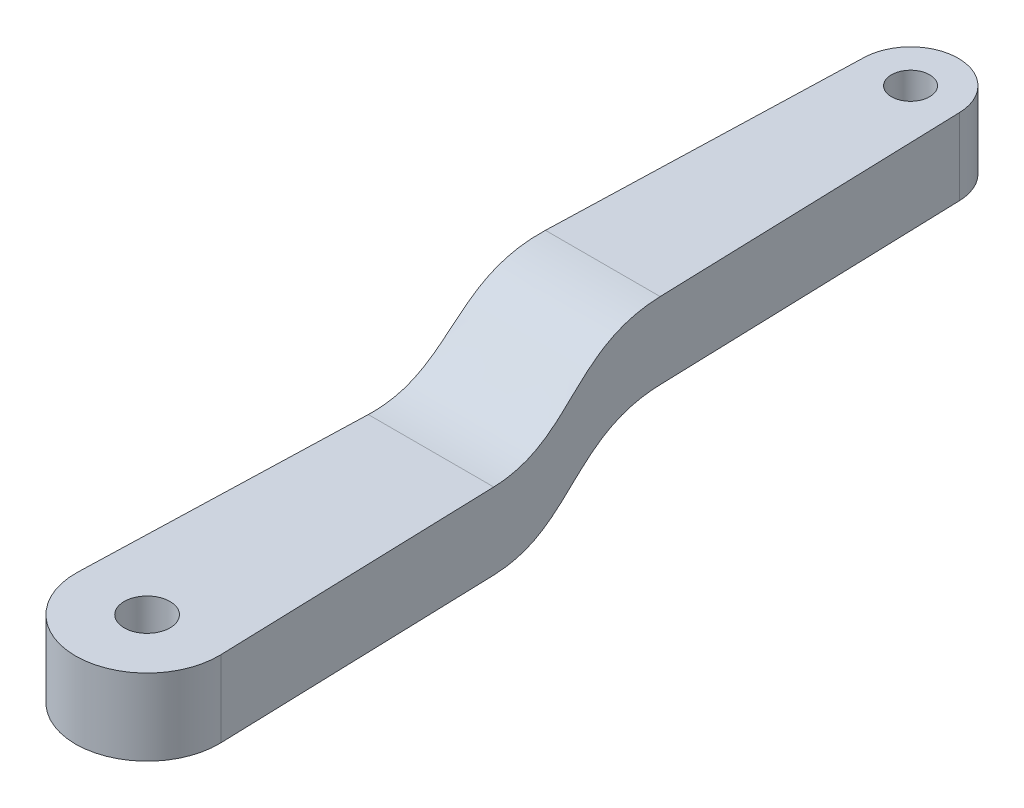
ISO-10303-21;
HEADER;
FILE_DESCRIPTION(('STEP AP214'),'2;1');
FILE_NAME('part.step','',(''),(''),'','','');
FILE_SCHEMA(('AUTOMOTIVE_DESIGN { 1 0 10303 214 1 1 1 1 }'));
ENDSEC;
DATA;
#1=APPLICATION_CONTEXT('core data for automotive mechanical design processes');
#2=APPLICATION_PROTOCOL_DEFINITION('international standard','automotive_design',2000,#1);
#3=PRODUCT_CONTEXT('',#1,'mechanical');
#4=PRODUCT('Part','Part','',(#3));
#5=PRODUCT_RELATED_PRODUCT_CATEGORY('part','',(#4));
#6=PRODUCT_DEFINITION_FORMATION('','',#4);
#7=PRODUCT_DEFINITION_CONTEXT('part definition',#1,'design');
#8=PRODUCT_DEFINITION('design','',#6,#7);
#9=PRODUCT_DEFINITION_SHAPE('','',#8);
#10=(LENGTH_UNIT() NAMED_UNIT(*) SI_UNIT(.MILLI.,.METRE.));
#11=(NAMED_UNIT(*) PLANE_ANGLE_UNIT() SI_UNIT($,.RADIAN.));
#12=(NAMED_UNIT(*) SI_UNIT($,.STERADIAN.) SOLID_ANGLE_UNIT());
#13=UNCERTAINTY_MEASURE_WITH_UNIT(LENGTH_MEASURE(1.E-05),#10,'distance_accuracy_value','');
#14=(GEOMETRIC_REPRESENTATION_CONTEXT(3) GLOBAL_UNCERTAINTY_ASSIGNED_CONTEXT((#13)) GLOBAL_UNIT_ASSIGNED_CONTEXT((#10,
#11,#12)) REPRESENTATION_CONTEXT('',''));
#15=CARTESIAN_POINT('',(0.,0.,0.));
#16=DIRECTION('',(0.,0.,1.));
#17=DIRECTION('',(1.,0.,0.));
#18=AXIS2_PLACEMENT_3D('',#15,#16,#17);
#19=CARTESIAN_POINT('',(-3.74816849805925,8.,-0.1171875));
#20=DIRECTION('',(-0.999511599482467,0.,-0.03125));
#21=DIRECTION('',(-0.03125,0.,0.999511599482467));
#22=AXIS2_PLACEMENT_3D('',#19,#20,#21);
#23=PLANE('',#22);
#24=CARTESIAN_POINT('',(-3.00537407625422,8.,-23.875));
#25=CARTESIAN_POINT('',(-3.00899626856634,7.99999811447068,-23.7591464565915));
#26=CARTESIAN_POINT('',(-3.01261921682236,7.99762205224938,-23.6432687347923));
#27=CARTESIAN_POINT('',(-3.01986588461488,7.98762582819716,-23.4114886222733));
#28=CARTESIAN_POINT('',(-3.02348958842345,7.97999417897568,-23.2955867346013));
#29=CARTESIAN_POINT('',(-3.03072334807188,7.95898012807748,-23.0642194809542));
#30=CARTESIAN_POINT('',(-3.03433339385222,7.94559409919129,-22.9487544367264));
#31=CARTESIAN_POINT('',(-3.04149604222825,7.91273441010356,-22.7196616324111));
#32=CARTESIAN_POINT('',(-3.04504887293707,7.89331211981688,-22.6060265762684));
#33=CARTESIAN_POINT('',(-3.05211162574662,7.84795765008467,-22.3801288688307));
#34=CARTESIAN_POINT('',(-3.05562157399063,7.82202966826932,-22.2678653813596));
#35=CARTESIAN_POINT('',(-3.06258461104756,7.76337242746774,-22.0451570195667));
#36=CARTESIAN_POINT('',(-3.06603771670245,7.7306452236531,-21.9347116065653));
#37=CARTESIAN_POINT('',(-3.07291092354682,7.65784401594248,-21.7148764076344));
#38=CARTESIAN_POINT('',(-3.07633021129159,7.6176911978973,-21.6055126392227));
#39=CARTESIAN_POINT('',(-3.08308128289557,7.53035833438566,-21.3895838591549));
#40=CARTESIAN_POINT('',(-3.08641303761071,7.48317598246282,-21.2830197796536));
#41=CARTESIAN_POINT('',(-3.09297523558486,7.38213161146654,-21.0731320038694));
#42=CARTESIAN_POINT('',(-3.09620569551587,7.32827069891802,-20.9698077743426));
#43=CARTESIAN_POINT('',(-3.10255697599939,7.21447136156176,-20.7666660618676));
#44=CARTESIAN_POINT('',(-3.10567787141685,7.15453719986446,-20.6668461844109));
#45=CARTESIAN_POINT('',(-3.11181289404608,7.02931859653401,-20.4706213434187));
#46=CARTESIAN_POINT('',(-3.11482701142475,6.96403366397703,-20.3742166943891));
#47=CARTESIAN_POINT('',(-3.12075588242364,6.82902127836733,-20.1845854836616));
#48=CARTESIAN_POINT('',(-3.12367063528852,6.75929379155421,-20.0913589461235));
#49=CARTESIAN_POINT('',(-3.1307123920809,6.58409364820335,-19.8661327830925));
#50=CARTESIAN_POINT('',(-3.13479241107756,6.47669878602012,-19.7356359410677));
#51=CARTESIAN_POINT('',(-3.14283976761855,6.25765857049981,-19.4782463024154));
#52=CARTESIAN_POINT('',(-3.1468070645867,6.14601171960363,-19.3513548035909));
#53=CARTESIAN_POINT('',(-3.15472022147431,5.92133612519889,-19.0982574564649));
#54=CARTESIAN_POINT('',(-3.15866600460157,5.80830465688984,-18.9720540643132));
#55=CARTESIAN_POINT('',(-3.166616737175,5.58433355528527,-18.7177548825045));
#56=CARTESIAN_POINT('',(-3.17062168915927,5.47339401219281,-18.5896590116673));
#57=CARTESIAN_POINT('',(-3.17746137297173,5.29192512122272,-18.3708960258325));
#58=CARTESIAN_POINT('',(-3.18025701645692,5.21990066362941,-18.2814791269057));
#59=CARTESIAN_POINT('',(-3.18593704499896,5.07951910489883,-18.0998069856846));
#60=CARTESIAN_POINT('',(-3.18882142131982,5.01116164454244,-18.0075520228054));
#61=CARTESIAN_POINT('',(-3.19469631094334,4.8792458364324,-17.819647372425));
#62=CARTESIAN_POINT('',(-3.19768682736743,4.81568762999029,-17.7239975850868));
#63=CARTESIAN_POINT('',(-3.20376665918675,4.69479797224297,-17.5295379874449));
#64=CARTESIAN_POINT('',(-3.20685535373065,4.63743474417882,-17.4307480346805));
#65=CARTESIAN_POINT('',(-3.21314705154159,4.52948419680022,-17.2295120365213));
#66=CARTESIAN_POINT('',(-3.2163500620259,4.47889730626798,-17.1270657602866));
#67=CARTESIAN_POINT('',(-3.22285965374168,4.38523774027144,-16.9188605625967));
#68=CARTESIAN_POINT('',(-3.22616617115923,4.34216053852604,-16.813103682189));
#69=CARTESIAN_POINT('',(-3.23252783162669,4.26785551141483,-16.6096299724548));
#70=CARTESIAN_POINT('',(-3.23557433808391,4.23586812949275,-16.5121893791145));
#71=CARTESIAN_POINT('',(-3.2417269258232,4.17827945117677,-16.3154027291224));
#72=CARTESIAN_POINT('',(-3.24483302921588,4.15268057627399,-16.2160559652766));
#73=CARTESIAN_POINT('',(-3.25109105069711,4.10773049962799,-16.0158970833471));
#74=CARTESIAN_POINT('',(-3.25424299850553,4.08838355846379,-15.9150840146919));
#75=CARTESIAN_POINT('',(-3.26064609014878,4.0553106814114,-15.7102851548525));
#76=CARTESIAN_POINT('',(-3.26389789614713,4.04171687806328,-15.6062781847847));
#77=CARTESIAN_POINT('',(-3.27041789545357,4.02036104210541,-15.3977401068517));
#78=CARTESIAN_POINT('',(-3.27368607846221,4.01259571814255,-15.2932093284079));
#79=CARTESIAN_POINT('',(-3.28022363463297,4.0024198611043,-15.0841097052098));
#80=CARTESIAN_POINT('',(-3.28349299001051,3.99999780980068,-14.979541429284));
#81=CARTESIAN_POINT('',(-3.28676150602055,3.99999999999999,-14.875));
#82=B_SPLINE_CURVE_WITH_KNOTS('',3,(#24,#25,#26,#27,#28,#29,#30,#31,#32,#33,#34,#35,#36,#37,#38,
#39,#40,#41,#42,#43,#44,#45,#46,#47,#48,#49,#50,#51,#52,#53,#54,#55,#56,#57,#58,#59,#60,#61,#62,
#63,#64,#65,#66,#67,#68,#69,#70,#71,#72,#73,#74,#75,#76,#77,#78,#79,#80,#81),.UNSPECIFIED.,.F.,
.F.,(4,2,2,2,2,2,2,2,2,2,2,2,2,2,2,2,2,2,2,2,2,2,2,2,2,2,2,2,4),(0.,0.347742323620094,
0.696247146968814,1.04497196933054,1.39080677439318,1.7364190096799,2.08192692983732,
2.43133774271035,2.78086345408208,3.13033133212243,3.4795555788932,3.82881190231912,
4.17807088017356,4.68505406893024,5.19221750017961,5.70062915463697,6.2090626817198,
6.55354643904929,6.89799638888688,7.24245647692373,7.58505612991816,7.92767745115358,
8.27009154638711,8.57768016079997,8.88538518671488,9.19329946793341,9.50794533828519,
9.82241339357373,10.1362029005321),.UNSPECIFIED.);
#83=CARTESIAN_POINT('',(-3.00537407625422,8.,-23.875));
#84=VERTEX_POINT('',#83);
#85=CARTESIAN_POINT('',(-3.28676150602055,3.99999999999999,-14.875));
#86=VERTEX_POINT('',#85);
#87=EDGE_CURVE('E170',#84,#86,#82,.T.);
#88=ORIENTED_EDGE('',*,*,#87,.F.);
#89=DIRECTION('',(0.03125,0.,-0.999511599482467));
#90=VECTOR('',#89,1.);
#91=CARTESIAN_POINT('',(-3.74816849805925,8.,-0.1171875));
#92=LINE('',#91,#90);
#93=CARTESIAN_POINT('',(-2.49877899870617,8.,-40.078125));
#94=VERTEX_POINT('',#93);
#95=EDGE_CURVE('E152',#84,#94,#92,.T.);
#96=ORIENTED_EDGE('',*,*,#95,.T.);
#97=DIRECTION('',(0.,-1.,0.));
#98=VECTOR('',#97,1.);
#99=CARTESIAN_POINT('',(-2.49877899870617,8.,-40.078125));
#100=LINE('',#99,#98);
#101=CARTESIAN_POINT('',(-2.49877899870617,3.99999999999997,-40.078125));
#102=VERTEX_POINT('',#101);
#103=EDGE_CURVE('E153',#94,#102,#100,.T.);
#104=ORIENTED_EDGE('',*,*,#103,.T.);
#105=DIRECTION('',(0.03125,0.,-0.999511599482467));
#106=VECTOR('',#105,1.);
#107=CARTESIAN_POINT('',(-3.74816849805925,3.99999999999956,-0.117187500000041));
#108=LINE('',#107,#106);
#109=CARTESIAN_POINT('',(-3.00537407625422,3.99999999999981,-23.8750000000001));
#110=VERTEX_POINT('',#109);
#111=EDGE_CURVE('E125',#110,#102,#108,.T.);
#112=ORIENTED_EDGE('',*,*,#111,.F.);
#113=CARTESIAN_POINT('',(-3.28676150602055,-2.05564731903252E-13,-14.875));
#114=CARTESIAN_POINT('',(-3.28426184922358,-3.10916420886166E-07,-14.9549499508253));
#115=CARTESIAN_POINT('',(-3.28176190787284,0.00141544638103309,-15.0349090029242));
#116=CARTESIAN_POINT('',(-3.27676038883779,0.00729896382046686,-15.1948794442223));
#117=CARTESIAN_POINT('',(-3.27425881850231,0.0117730439407663,-15.2748905983737));
#118=CARTESIAN_POINT('',(-3.26926097800554,0.0240007171491219,-15.4347433839381));
#119=CARTESIAN_POINT('',(-3.26676471521751,0.0317574478542365,-15.514584779522));
#120=CARTESIAN_POINT('',(-3.26178459192593,0.0507565413293511,-15.673870891419));
#121=CARTESIAN_POINT('',(-3.25930073390822,0.0619995763303122,-15.7533155282243));
#122=CARTESIAN_POINT('',(-3.25444100020128,0.0876796895535889,-15.9087510549601));
#123=CARTESIAN_POINT('',(-3.25206445786074,0.101987119071783,-15.9847632673129));
#124=CARTESIAN_POINT('',(-3.24733606996942,0.134126576001462,-16.135997780728));
#125=CARTESIAN_POINT('',(-3.24498421142991,0.151956640598806,-16.2112204972268));
#126=CARTESIAN_POINT('',(-3.24031121316153,0.191219283005152,-16.3606834083823));
#127=CARTESIAN_POINT('',(-3.23799005884654,0.212650078736213,-16.4349240695674));
#128=CARTESIAN_POINT('',(-3.23338416691736,0.259137001430183,-16.5822406266603));
#129=CARTESIAN_POINT('',(-3.23109942034004,0.284192220305363,-16.6553168092483));
#130=CARTESIAN_POINT('',(-3.22577842179646,0.347302288819191,-16.8255056017323));
#131=CARTESIAN_POINT('',(-3.22275918608796,0.38683687880492,-16.9220739573247));
#132=CARTESIAN_POINT('',(-3.21680709705607,0.472176722469682,-17.1124477822383));
#133=CARTESIAN_POINT('',(-3.21387428638797,0.517985011583562,-17.2062518872573));
#134=CARTESIAN_POINT('',(-3.20810325912489,0.615330808164649,-17.3908345653491));
#135=CARTESIAN_POINT('',(-3.20526504809516,0.666868651927938,-17.481612960421));
#136=CARTESIAN_POINT('',(-3.19822654991688,0.803236577579346,-17.7067348987291));
#137=CARTESIAN_POINT('',(-3.19408922337614,0.891394315511503,-17.8390646865152));
#138=CARTESIAN_POINT('',(-3.18601155289183,1.07654177664094,-18.097423897583));
#139=CARTESIAN_POINT('',(-3.18207134381031,1.1735374218522,-18.2234490073866));
#140=CARTESIAN_POINT('',(-3.17621693313786,1.32475052371355,-18.4106986513944));
#141=CARTESIAN_POINT('',(-3.1742485165408,1.37685496303989,-18.4736572184787));
#142=CARTESIAN_POINT('',(-3.17034199672757,1.48217537305044,-18.5986047982205));
#143=CARTESIAN_POINT('',(-3.16840388394272,1.53539097995111,-18.6605941169265));
#144=CARTESIAN_POINT('',(-3.16261947566933,1.69615843268284,-18.8456047782189));
#145=CARTESIAN_POINT('',(-3.15880353931474,1.80481955323385,-18.9676551029965));
#146=CARTESIAN_POINT('',(-3.15116859644418,2.02225977532091,-19.2118539497329));
#147=CARTESIAN_POINT('',(-3.14734959048039,2.13103889034325,-19.3340024540307));
#148=CARTESIAN_POINT('',(-3.1396264500734,2.34598325012027,-19.5810222435095));
#149=CARTESIAN_POINT('',(-3.13572216813251,2.45214315552807,-19.7058982463118));
#150=CARTESIAN_POINT('',(-3.12787115795367,2.65612700833793,-19.9570078700369));
#151=CARTESIAN_POINT('',(-3.12392815029102,2.75409566924486,-20.083122490698));
#152=CARTESIAN_POINT('',(-3.11586089673133,2.94206054796984,-20.3411485229823));
#153=CARTESIAN_POINT('',(-3.11173671976061,3.03205975915146,-20.47305773004));
#154=CARTESIAN_POINT('',(-3.10329564595472,3.20157133937444,-20.7430401678342));
#155=CARTESIAN_POINT('',(-3.09897925160187,3.28110912323676,-20.8810973269901));
#156=CARTESIAN_POINT('',(-3.09015795900712,3.42799293409708,-21.1632408236582));
#157=CARTESIAN_POINT('',(-3.08565346079606,3.4953633584271,-21.3073143664358));
#158=CARTESIAN_POINT('',(-3.07820015519447,3.59421720643877,-21.5457036593407));
#159=CARTESIAN_POINT('',(-3.0753022251385,3.62967772596589,-21.6383921299146));
#160=CARTESIAN_POINT('',(-3.06944654032857,3.6954937975381,-21.8256825264084));
#161=CARTESIAN_POINT('',(-3.06648872301669,3.72584366625831,-21.9202864532044));
#162=CARTESIAN_POINT('',(-3.06052292503167,3.78145688479419,-22.1110987503628));
#163=CARTESIAN_POINT('',(-3.05751488668034,3.80671387782111,-22.2073089655257));
#164=CARTESIAN_POINT('',(-3.05145891959695,3.85226330923503,-22.4010052645954));
#165=CARTESIAN_POINT('',(-3.04841095005528,3.87255016992129,-22.498492653772));
#166=CARTESIAN_POINT('',(-3.04204733008362,3.90974765535889,-22.7020290370159));
#167=CARTESIAN_POINT('',(-3.03872945870321,3.92626793277889,-22.8081490667859));
#168=CARTESIAN_POINT('',(-3.03207455611201,3.95407837207277,-23.0210019414525));
#169=CARTESIAN_POINT('',(-3.0287375371523,3.96537156689351,-23.127734394506));
#170=CARTESIAN_POINT('',(-3.02205835771419,3.98310079227812,-23.3413637488555));
#171=CARTESIAN_POINT('',(-3.01871622348338,3.98954715617945,-23.4482598106384));
#172=CARTESIAN_POINT('',(-3.01204055508105,3.99798662050492,-23.6617768667163));
#173=CARTESIAN_POINT('',(-3.00870704438009,3.99999845369575,-23.7683971103197));
#174=CARTESIAN_POINT('',(-3.00537407625422,3.99999999999981,-23.875));
#175=B_SPLINE_CURVE_WITH_KNOTS('',3,(#113,#114,#115,#116,#117,#118,#119,#120,#121,#122,#123,
#124,#125,#126,#127,#128,#129,#130,#131,#132,#133,#134,#135,#136,#137,#138,#139,#140,#141,#142,
#143,#144,#145,#146,#147,#148,#149,#150,#151,#152,#153,#154,#155,#156,#157,#158,#159,#160,#161,
#162,#163,#164,#165,#166,#167,#168,#169,#170,#171,#172,#173,#174),.UNSPECIFIED.,.F.,.F.,(4,2,2,
2,2,2,2,2,2,2,2,2,2,2,2,2,2,2,2,2,2,2,2,2,2,2,2,2,2,2,4),(0.,0.239968101478008,
0.480433598566049,0.721129457908716,0.961871757239138,1.19394179146688,1.42588287899881,
1.65770951031231,1.88947815847687,2.20241001166213,2.51549381065197,2.8285959958002,
3.30525424497932,3.78223427079711,4.02746468683307,4.27261603844305,4.76297217560871,
5.25379706165097,5.74555132026329,6.2245647532822,6.70339749655164,7.18104459526036,
7.65772304292402,7.95543381685551,8.25347350591741,8.5518829281364,8.85062572005747,
9.17283348327795,9.4948540545262,9.81618612289313,10.1361581671943),.UNSPECIFIED.);
#176=CARTESIAN_POINT('',(-3.28676150602055,-2.05564731903252E-13,-14.875));
#177=VERTEX_POINT('',#176);
#178=EDGE_CURVE('E108',#177,#110,#175,.T.);
#179=ORIENTED_EDGE('',*,*,#178,.F.);
#180=DIRECTION('',(0.03125,0.,-0.999511599482467));
#181=VECTOR('',#180,1.);
#182=CARTESIAN_POINT('',(-3.74816849805925,0.,-0.1171875));
#183=LINE('',#182,#181);
#184=CARTESIAN_POINT('',(-3.74816849805925,0.,-0.1171875));
#185=VERTEX_POINT('',#184);
#186=EDGE_CURVE('E122',#185,#177,#183,.T.);
#187=ORIENTED_EDGE('',*,*,#186,.F.);
#188=DIRECTION('',(0.,-1.,0.));
#189=VECTOR('',#188,1.);
#190=CARTESIAN_POINT('',(-3.74816849805925,8.,-0.1171875));
#191=LINE('',#190,#189);
#192=CARTESIAN_POINT('',(-3.74816849805925,4.,-0.1171875));
#193=VERTEX_POINT('',#192);
#194=EDGE_CURVE('E115',#193,#185,#191,.T.);
#195=ORIENTED_EDGE('',*,*,#194,.F.);
#196=DIRECTION('',(-0.03125,0.,0.999511599482467));
#197=VECTOR('',#196,1.);
#198=CARTESIAN_POINT('',(-3.74816849805925,4.,-0.117187499999998));
#199=LINE('',#198,#197);
#200=EDGE_CURVE('E254',#86,#193,#199,.T.);
#201=ORIENTED_EDGE('',*,*,#200,.F.);
#202=EDGE_LOOP('',(#88,#96,#104,#112,#179,#187,#195,#201));
#203=FACE_BOUND('',#202,.T.);
#204=ADVANCED_FACE('F41',(#203),#23,.T.);
#205=CARTESIAN_POINT('',(0.,8.,0.));
#206=DIRECTION('',(0.,-1.,0.));
#207=DIRECTION('',(0.,0.,-1.));
#208=AXIS2_PLACEMENT_3D('',#205,#206,#207);
#209=CYLINDRICAL_SURFACE('',#208,3.75);
#210=CARTESIAN_POINT('',(0.,4.,0.));
#211=DIRECTION('',(0.,-1.,0.));
#212=DIRECTION('',(0.,0.,-1.));
#213=AXIS2_PLACEMENT_3D('',#210,#211,#212);
#214=CIRCLE('',#213,3.75);
#215=CARTESIAN_POINT('',(3.74816849805925,4.,-0.1171875));
#216=VERTEX_POINT('',#215);
#217=EDGE_CURVE('E176',#216,#193,#214,.T.);
#218=ORIENTED_EDGE('',*,*,#217,.T.);
#219=ORIENTED_EDGE('',*,*,#194,.T.);
#220=CARTESIAN_POINT('',(0.,0.,0.));
#221=DIRECTION('',(0.,1.,0.));
#222=DIRECTION('',(0.,0.,1.));
#223=AXIS2_PLACEMENT_3D('',#220,#221,#222);
#224=CIRCLE('',#223,3.75);
#225=CARTESIAN_POINT('',(3.74816849805925,0.,-0.1171875));
#226=VERTEX_POINT('',#225);
#227=EDGE_CURVE('E132',#185,#226,#224,.T.);
#228=ORIENTED_EDGE('',*,*,#227,.T.);
#229=DIRECTION('',(0.,-1.,0.));
#230=VECTOR('',#229,1.);
#231=CARTESIAN_POINT('',(3.74816849805925,8.,-0.1171875));
#232=LINE('',#231,#230);
#233=EDGE_CURVE('E160',#216,#226,#232,.T.);
#234=ORIENTED_EDGE('',*,*,#233,.F.);
#235=EDGE_LOOP('',(#218,#219,#228,#234));
#236=FACE_BOUND('',#235,.T.);
#237=ADVANCED_FACE('F240',(#236),#209,.T.);
#238=CARTESIAN_POINT('',(3.74816849805925,8.,-0.1171875));
#239=DIRECTION('',(-0.999511599482467,0.,0.03125));
#240=DIRECTION('',(0.03125,0.,0.999511599482467));
#241=AXIS2_PLACEMENT_3D('',#238,#239,#240);
#242=PLANE('',#241);
#243=DIRECTION('',(-0.03125,0.,-0.999511599482467));
#244=VECTOR('',#243,1.);
#245=CARTESIAN_POINT('',(3.74816849805925,8.,-0.1171875));
#246=LINE('',#245,#244);
#247=CARTESIAN_POINT('',(3.00537407625422,8.,-23.875));
#248=VERTEX_POINT('',#247);
#249=CARTESIAN_POINT('',(2.49877899870617,8.,-40.078125));
#250=VERTEX_POINT('',#249);
#251=EDGE_CURVE('E267',#248,#250,#246,.T.);
#252=ORIENTED_EDGE('',*,*,#251,.F.);
#253=CARTESIAN_POINT('',(3.00537407625422,8.,-23.875));
#254=CARTESIAN_POINT('',(3.00899626856634,7.99999811447068,-23.7591464565915));
#255=CARTESIAN_POINT('',(3.01261921682236,7.99762205224938,-23.6432687347923));
#256=CARTESIAN_POINT('',(3.01986588461488,7.98762582819716,-23.4114886222733));
#257=CARTESIAN_POINT('',(3.02348958842345,7.97999417897568,-23.2955867346013));
#258=CARTESIAN_POINT('',(3.03072334807188,7.95898012807748,-23.0642194809542));
#259=CARTESIAN_POINT('',(3.03433339385222,7.94559409919129,-22.9487544367264));
#260=CARTESIAN_POINT('',(3.04149604222825,7.91273441010356,-22.7196616324111));
#261=CARTESIAN_POINT('',(3.04504887293707,7.89331211981688,-22.6060265762684));
#262=CARTESIAN_POINT('',(3.05211162574662,7.84795765008467,-22.3801288688307));
#263=CARTESIAN_POINT('',(3.05562157399063,7.82202966826932,-22.2678653813596));
#264=CARTESIAN_POINT('',(3.06258461104756,7.76337242746774,-22.0451570195667));
#265=CARTESIAN_POINT('',(3.06603771670245,7.7306452236531,-21.9347116065653));
#266=CARTESIAN_POINT('',(3.07291092354682,7.65784401594248,-21.7148764076344));
#267=CARTESIAN_POINT('',(3.07633021129159,7.6176911978973,-21.6055126392227));
#268=CARTESIAN_POINT('',(3.08308128289557,7.53035833438566,-21.3895838591549));
#269=CARTESIAN_POINT('',(3.08641303761071,7.48317598246282,-21.2830197796536));
#270=CARTESIAN_POINT('',(3.09297523558486,7.38213161146654,-21.0731320038694));
#271=CARTESIAN_POINT('',(3.09620569551587,7.32827069891802,-20.9698077743426));
#272=CARTESIAN_POINT('',(3.10255697599939,7.21447136156176,-20.7666660618676));
#273=CARTESIAN_POINT('',(3.10567787141685,7.15453719986446,-20.6668461844109));
#274=CARTESIAN_POINT('',(3.11181289404608,7.02931859653401,-20.4706213434187));
#275=CARTESIAN_POINT('',(3.11482701142475,6.96403366397703,-20.3742166943891));
#276=CARTESIAN_POINT('',(3.12075588242364,6.82902127836733,-20.1845854836616));
#277=CARTESIAN_POINT('',(3.12367063528852,6.75929379155421,-20.0913589461235));
#278=CARTESIAN_POINT('',(3.1307123920809,6.58409364820335,-19.8661327830925));
#279=CARTESIAN_POINT('',(3.13479241107756,6.47669878602012,-19.7356359410677));
#280=CARTESIAN_POINT('',(3.14283976761855,6.25765857049981,-19.4782463024154));
#281=CARTESIAN_POINT('',(3.1468070645867,6.14601171960363,-19.3513548035909));
#282=CARTESIAN_POINT('',(3.15472022147431,5.92133612519889,-19.0982574564649));
#283=CARTESIAN_POINT('',(3.15866600460158,5.80830465688984,-18.9720540643132));
#284=CARTESIAN_POINT('',(3.166616737175,5.58433355528527,-18.7177548825045));
#285=CARTESIAN_POINT('',(3.17062168915927,5.47339401219281,-18.5896590116673));
#286=CARTESIAN_POINT('',(3.17746137297173,5.29192512122272,-18.3708960258325));
#287=CARTESIAN_POINT('',(3.18025701645692,5.2199006636294,-18.2814791269057));
#288=CARTESIAN_POINT('',(3.18593704499896,5.07951910489883,-18.0998069856846));
#289=CARTESIAN_POINT('',(3.18882142131982,5.01116164454244,-18.0075520228054));
#290=CARTESIAN_POINT('',(3.19469631094334,4.8792458364324,-17.819647372425));
#291=CARTESIAN_POINT('',(3.19768682736743,4.81568762999029,-17.7239975850868));
#292=CARTESIAN_POINT('',(3.20376665918675,4.69479797224297,-17.5295379874449));
#293=CARTESIAN_POINT('',(3.20685535373065,4.63743474417883,-17.4307480346805));
#294=CARTESIAN_POINT('',(3.21314705154159,4.52948419680023,-17.2295120365213));
#295=CARTESIAN_POINT('',(3.2163500620259,4.47889730626798,-17.1270657602866));
#296=CARTESIAN_POINT('',(3.22285965374168,4.38523774027144,-16.9188605625967));
#297=CARTESIAN_POINT('',(3.22616617115924,4.34216053852604,-16.813103682189));
#298=CARTESIAN_POINT('',(3.23252783162669,4.26785551141483,-16.6096299724548));
#299=CARTESIAN_POINT('',(3.23557433808391,4.23586812949275,-16.5121893791145));
#300=CARTESIAN_POINT('',(3.2417269258232,4.17827945117677,-16.3154027291224));
#301=CARTESIAN_POINT('',(3.24483302921588,4.15268057627399,-16.2160559652766));
#302=CARTESIAN_POINT('',(3.25109105069711,4.10773049962799,-16.0158970833471));
#303=CARTESIAN_POINT('',(3.25424299850553,4.08838355846379,-15.9150840146919));
#304=CARTESIAN_POINT('',(3.26064609014878,4.0553106814114,-15.7102851548525));
#305=CARTESIAN_POINT('',(3.26389789614713,4.04171687806328,-15.6062781847847));
#306=CARTESIAN_POINT('',(3.27041789545357,4.02036104210541,-15.3977401068517));
#307=CARTESIAN_POINT('',(3.27368607846221,4.01259571814255,-15.2932093284079));
#308=CARTESIAN_POINT('',(3.28022363463297,4.0024198611043,-15.0841097052098));
#309=CARTESIAN_POINT('',(3.28349299001051,3.99999780980068,-14.979541429284));
#310=CARTESIAN_POINT('',(3.28676150602055,3.99999999999999,-14.875));
#311=B_SPLINE_CURVE_WITH_KNOTS('',3,(#253,#254,#255,#256,#257,#258,#259,#260,#261,#262,#263,
#264,#265,#266,#267,#268,#269,#270,#271,#272,#273,#274,#275,#276,#277,#278,#279,#280,#281,#282,
#283,#284,#285,#286,#287,#288,#289,#290,#291,#292,#293,#294,#295,#296,#297,#298,#299,#300,#301,
#302,#303,#304,#305,#306,#307,#308,#309,#310),.UNSPECIFIED.,.F.,.F.,(4,2,2,2,2,2,2,2,2,2,2,2,2,
2,2,2,2,2,2,2,2,2,2,2,2,2,2,2,4),(0.,0.347742323620094,0.696247146968814,1.04497196933054,
1.39080677439318,1.7364190096799,2.08192692983732,2.43133774271035,2.78086345408208,
3.13033133212243,3.4795555788932,3.82881190231912,4.17807088017355,4.68505406893024,
5.19221750017961,5.70062915463697,6.2090626817198,6.55354643904929,6.89799638888687,
7.24245647692374,7.58505612991816,7.92767745115358,8.27009154638711,8.57768016079997,
8.88538518671488,9.19329946793341,9.50794533828519,9.82241339357372,10.1362029005321),.UNSPECIFIED.);
#312=CARTESIAN_POINT('',(3.28676150602055,3.99999999999999,-14.875));
#313=VERTEX_POINT('',#312);
#314=EDGE_CURVE('E57',#248,#313,#311,.T.);
#315=ORIENTED_EDGE('',*,*,#314,.T.);
#316=DIRECTION('',(0.03125,0.,0.999511599482467));
#317=VECTOR('',#316,1.);
#318=CARTESIAN_POINT('',(3.74816849805925,4.,-0.117187499999998));
#319=LINE('',#318,#317);
#320=EDGE_CURVE('E169',#313,#216,#319,.T.);
#321=ORIENTED_EDGE('',*,*,#320,.T.);
#322=ORIENTED_EDGE('',*,*,#233,.T.);
#323=DIRECTION('',(-0.03125,0.,-0.999511599482467));
#324=VECTOR('',#323,1.);
#325=CARTESIAN_POINT('',(3.74816849805925,0.,-0.1171875));
#326=LINE('',#325,#324);
#327=CARTESIAN_POINT('',(3.28676150602055,-1.02782365951626E-13,-14.875));
#328=VERTEX_POINT('',#327);
#329=EDGE_CURVE('E138',#226,#328,#326,.T.);
#330=ORIENTED_EDGE('',*,*,#329,.T.);
#331=CARTESIAN_POINT('',(3.28676150602054,-2.05564731903252E-13,-14.875));
#332=CARTESIAN_POINT('',(3.28426184922358,-3.10916420881725E-07,-14.9549499508253));
#333=CARTESIAN_POINT('',(3.28176190787284,0.00141544638103309,-15.0349090029242));
#334=CARTESIAN_POINT('',(3.27676038883779,0.00729896382046686,-15.1948794442223));
#335=CARTESIAN_POINT('',(3.27425881850231,0.0117730439407663,-15.2748905983737));
#336=CARTESIAN_POINT('',(3.26926097800554,0.0240007171491219,-15.4347433839381));
#337=CARTESIAN_POINT('',(3.26676471521751,0.0317574478542365,-15.514584779522));
#338=CARTESIAN_POINT('',(3.26178459192593,0.0507565413293511,-15.673870891419));
#339=CARTESIAN_POINT('',(3.25930073390822,0.0619995763303122,-15.7533155282243));
#340=CARTESIAN_POINT('',(3.25444100020128,0.0876796895535889,-15.9087510549601));
#341=CARTESIAN_POINT('',(3.25206445786074,0.101987119071783,-15.9847632673129));
#342=CARTESIAN_POINT('',(3.24733606996942,0.134126576001462,-16.135997780728));
#343=CARTESIAN_POINT('',(3.24498421142991,0.151956640598806,-16.2112204972268));
#344=CARTESIAN_POINT('',(3.24031121316153,0.191219283005152,-16.3606834083823));
#345=CARTESIAN_POINT('',(3.23799005884654,0.212650078736213,-16.4349240695674));
#346=CARTESIAN_POINT('',(3.23338416691736,0.259137001430183,-16.5822406266603));
#347=CARTESIAN_POINT('',(3.23109942034004,0.284192220305363,-16.6553168092483));
#348=CARTESIAN_POINT('',(3.22577842179646,0.347302288819191,-16.8255056017323));
#349=CARTESIAN_POINT('',(3.22275918608796,0.386836878804919,-16.9220739573247));
#350=CARTESIAN_POINT('',(3.21680709705607,0.472176722469682,-17.1124477822383));
#351=CARTESIAN_POINT('',(3.21387428638797,0.517985011583562,-17.2062518872573));
#352=CARTESIAN_POINT('',(3.20810325912489,0.615330808164649,-17.3908345653491));
#353=CARTESIAN_POINT('',(3.20526504809516,0.666868651927938,-17.481612960421));
#354=CARTESIAN_POINT('',(3.19822654991688,0.803236577579346,-17.7067348987291));
#355=CARTESIAN_POINT('',(3.19408922337614,0.891394315511503,-17.8390646865152));
#356=CARTESIAN_POINT('',(3.18601155289183,1.07654177664094,-18.097423897583));
#357=CARTESIAN_POINT('',(3.18207134381031,1.1735374218522,-18.2234490073866));
#358=CARTESIAN_POINT('',(3.17621693313786,1.32475052371355,-18.4106986513944));
#359=CARTESIAN_POINT('',(3.1742485165408,1.37685496303989,-18.4736572184787));
#360=CARTESIAN_POINT('',(3.17034199672757,1.48217537305044,-18.5986047982205));
#361=CARTESIAN_POINT('',(3.16840388394272,1.53539097995111,-18.6605941169265));
#362=CARTESIAN_POINT('',(3.16261947566933,1.69615843268284,-18.8456047782189));
#363=CARTESIAN_POINT('',(3.15880353931474,1.80481955323385,-18.9676551029965));
#364=CARTESIAN_POINT('',(3.15116859644418,2.02225977532091,-19.2118539497329));
#365=CARTESIAN_POINT('',(3.14734959048039,2.13103889034325,-19.3340024540307));
#366=CARTESIAN_POINT('',(3.1396264500734,2.34598325012027,-19.5810222435095));
#367=CARTESIAN_POINT('',(3.13572216813251,2.45214315552807,-19.7058982463118));
#368=CARTESIAN_POINT('',(3.12787115795367,2.65612700833793,-19.9570078700369));
#369=CARTESIAN_POINT('',(3.12392815029102,2.75409566924486,-20.083122490698));
#370=CARTESIAN_POINT('',(3.11586089673133,2.94206054796984,-20.3411485229823));
#371=CARTESIAN_POINT('',(3.11173671976061,3.03205975915146,-20.47305773004));
#372=CARTESIAN_POINT('',(3.10329564595472,3.20157133937444,-20.7430401678342));
#373=CARTESIAN_POINT('',(3.09897925160187,3.28110912323676,-20.8810973269901));
#374=CARTESIAN_POINT('',(3.09015795900712,3.42799293409708,-21.1632408236582));
#375=CARTESIAN_POINT('',(3.08565346079606,3.4953633584271,-21.3073143664358));
#376=CARTESIAN_POINT('',(3.07820015519447,3.59421720643877,-21.5457036593407));
#377=CARTESIAN_POINT('',(3.0753022251385,3.62967772596589,-21.6383921299146));
#378=CARTESIAN_POINT('',(3.06944654032857,3.6954937975381,-21.8256825264084));
#379=CARTESIAN_POINT('',(3.06648872301669,3.72584366625831,-21.9202864532044));
#380=CARTESIAN_POINT('',(3.06052292503167,3.78145688479419,-22.1110987503628));
#381=CARTESIAN_POINT('',(3.05751488668034,3.80671387782111,-22.2073089655257));
#382=CARTESIAN_POINT('',(3.05145891959695,3.85226330923503,-22.4010052645954));
#383=CARTESIAN_POINT('',(3.04841095005528,3.87255016992129,-22.498492653772));
#384=CARTESIAN_POINT('',(3.04204733008362,3.90974765535889,-22.7020290370159));
#385=CARTESIAN_POINT('',(3.03872945870321,3.92626793277889,-22.8081490667859));
#386=CARTESIAN_POINT('',(3.03207455611201,3.95407837207277,-23.0210019414525));
#387=CARTESIAN_POINT('',(3.0287375371523,3.96537156689351,-23.127734394506));
#388=CARTESIAN_POINT('',(3.02205835771419,3.98310079227812,-23.3413637488555));
#389=CARTESIAN_POINT('',(3.01871622348338,3.98954715617945,-23.4482598106384));
#390=CARTESIAN_POINT('',(3.01204055508105,3.99798662050492,-23.6617768667163));
#391=CARTESIAN_POINT('',(3.00870704438009,3.99999845369575,-23.7683971103197));
#392=CARTESIAN_POINT('',(3.00537407625422,3.99999999999981,-23.875));
#393=B_SPLINE_CURVE_WITH_KNOTS('',3,(#331,#332,#333,#334,#335,#336,#337,#338,#339,#340,#341,
#342,#343,#344,#345,#346,#347,#348,#349,#350,#351,#352,#353,#354,#355,#356,#357,#358,#359,#360,
#361,#362,#363,#364,#365,#366,#367,#368,#369,#370,#371,#372,#373,#374,#375,#376,#377,#378,#379,
#380,#381,#382,#383,#384,#385,#386,#387,#388,#389,#390,#391,#392),.UNSPECIFIED.,.F.,.F.,(4,2,2,
2,2,2,2,2,2,2,2,2,2,2,2,2,2,2,2,2,2,2,2,2,2,2,2,2,2,2,4),(0.,0.239968101478008,
0.480433598566049,0.721129457908716,0.961871757239138,1.19394179146688,1.42588287899881,
1.65770951031231,1.88947815847687,2.20241001166213,2.51549381065197,2.8285959958002,
3.30525424497932,3.78223427079711,4.02746468683307,4.27261603844305,4.76297217560871,
5.25379706165097,5.74555132026329,6.2245647532822,6.70339749655164,7.18104459526036,
7.65772304292402,7.95543381685551,8.25347350591741,8.5518829281364,8.85062572005747,
9.17283348327795,9.4948540545262,9.81618612289313,10.1361581671943),.UNSPECIFIED.);
#394=CARTESIAN_POINT('',(3.00537407625422,3.99999999999981,-23.8750000000001));
#395=VERTEX_POINT('',#394);
#396=EDGE_CURVE('E65',#328,#395,#393,.T.);
#397=ORIENTED_EDGE('',*,*,#396,.T.);
#398=DIRECTION('',(-0.03125,0.,-0.999511599482467));
#399=VECTOR('',#398,1.);
#400=CARTESIAN_POINT('',(3.74816849805925,3.99999999999956,-0.117187500000041));
#401=LINE('',#400,#399);
#402=CARTESIAN_POINT('',(2.49877899870617,3.99999999999997,-40.078125));
#403=VERTEX_POINT('',#402);
#404=EDGE_CURVE('E257',#395,#403,#401,.T.);
#405=ORIENTED_EDGE('',*,*,#404,.T.);
#406=DIRECTION('',(0.,-1.,0.));
#407=VECTOR('',#406,1.);
#408=CARTESIAN_POINT('',(2.49877899870617,8.,-40.078125));
#409=LINE('',#408,#407);
#410=EDGE_CURVE('E156',#250,#403,#409,.T.);
#411=ORIENTED_EDGE('',*,*,#410,.F.);
#412=EDGE_LOOP('',(#252,#315,#321,#322,#330,#397,#405,#411));
#413=FACE_BOUND('',#412,.T.);
#414=ADVANCED_FACE('F235',(#413),#242,.F.);
#415=CARTESIAN_POINT('',(0.,8.,-40.));
#416=DIRECTION('',(0.,-1.,0.));
#417=DIRECTION('',(0.,0.,-1.));
#418=AXIS2_PLACEMENT_3D('',#415,#416,#417);
#419=CYLINDRICAL_SURFACE('',#418,1.);
#420=CARTESIAN_POINT('',(0.,3.99999999999997,-40.));
#421=DIRECTION('',(0.,1.,0.));
#422=DIRECTION('',(0.,0.,1.));
#423=AXIS2_PLACEMENT_3D('',#420,#421,#422);
#424=CIRCLE('',#423,1.);
#425=CARTESIAN_POINT('',(0.,3.99999999999996,-39.));
#426=VERTEX_POINT('',#425);
#427=EDGE_CURVE('E134',#426,#426,#424,.T.);
#428=ORIENTED_EDGE('',*,*,#427,.F.);
#429=EDGE_LOOP('',(#428));
#430=FACE_BOUND('',#429,.T.);
#431=CARTESIAN_POINT('',(0.,8.,-40.));
#432=DIRECTION('',(0.,1.,0.));
#433=DIRECTION('',(0.,0.,1.));
#434=AXIS2_PLACEMENT_3D('',#431,#432,#433);
#435=CIRCLE('',#434,1.);
#436=CARTESIAN_POINT('',(0.,8.,-39.));
#437=VERTEX_POINT('',#436);
#438=EDGE_CURVE('E143',#437,#437,#435,.T.);
#439=ORIENTED_EDGE('',*,*,#438,.T.);
#440=EDGE_LOOP('',(#439));
#441=FACE_BOUND('',#440,.T.);
#442=ADVANCED_FACE('F239',(#430,#441),#419,.F.);
#443=CARTESIAN_POINT('',(0.,8.,-40.));
#444=DIRECTION('',(0.,-1.,0.));
#445=DIRECTION('',(0.,0.,-1.));
#446=AXIS2_PLACEMENT_3D('',#443,#444,#445);
#447=CYLINDRICAL_SURFACE('',#446,2.5);
#448=CARTESIAN_POINT('',(0.,3.99999999999997,-40.));
#449=DIRECTION('',(0.,1.,0.));
#450=DIRECTION('',(0.,0.,1.));
#451=AXIS2_PLACEMENT_3D('',#448,#449,#450);
#452=CIRCLE('',#451,2.5);
#453=EDGE_CURVE('E11',#403,#102,#452,.T.);
#454=ORIENTED_EDGE('',*,*,#453,.T.);
#455=ORIENTED_EDGE('',*,*,#103,.F.);
#456=CARTESIAN_POINT('',(0.,8.,-40.));
#457=DIRECTION('',(0.,1.,0.));
#458=DIRECTION('',(0.,0.,1.));
#459=AXIS2_PLACEMENT_3D('',#456,#457,#458);
#460=CIRCLE('',#459,2.5);
#461=EDGE_CURVE('E269',#250,#94,#460,.T.);
#462=ORIENTED_EDGE('',*,*,#461,.F.);
#463=ORIENTED_EDGE('',*,*,#410,.T.);
#464=EDGE_LOOP('',(#454,#455,#462,#463));
#465=FACE_BOUND('',#464,.T.);
#466=ADVANCED_FACE('F242',(#465),#447,.T.);
#467=CARTESIAN_POINT('',(0.,8.,0.));
#468=DIRECTION('',(0.,-1.,0.));
#469=DIRECTION('',(0.,0.,-1.));
#470=AXIS2_PLACEMENT_3D('',#467,#468,#469);
#471=CYLINDRICAL_SURFACE('',#470,1.2);
#472=CARTESIAN_POINT('',(0.,4.,0.));
#473=DIRECTION('',(0.,-1.,0.));
#474=DIRECTION('',(0.,0.,-1.));
#475=AXIS2_PLACEMENT_3D('',#472,#473,#474);
#476=CIRCLE('',#475,1.2);
#477=CARTESIAN_POINT('',(0.,4.,-1.2));
#478=VERTEX_POINT('',#477);
#479=EDGE_CURVE('E166',#478,#478,#476,.T.);
#480=ORIENTED_EDGE('',*,*,#479,.F.);
#481=EDGE_LOOP('',(#480));
#482=FACE_BOUND('',#481,.T.);
#483=CARTESIAN_POINT('',(0.,0.,0.));
#484=DIRECTION('',(0.,1.,0.));
#485=DIRECTION('',(0.,0.,1.));
#486=AXIS2_PLACEMENT_3D('',#483,#484,#485);
#487=CIRCLE('',#486,1.2);
#488=CARTESIAN_POINT('',(0.,0.,1.2));
#489=VERTEX_POINT('',#488);
#490=EDGE_CURVE('E148',#489,#489,#487,.T.);
#491=ORIENTED_EDGE('',*,*,#490,.F.);
#492=EDGE_LOOP('',(#491));
#493=FACE_BOUND('',#492,.T.);
#494=ADVANCED_FACE('F283',(#482,#493),#471,.F.);
#495=CARTESIAN_POINT('',(0.,8.,0.));
#496=DIRECTION('',(0.,1.,0.));
#497=DIRECTION('',(0.,0.,1.));
#498=AXIS2_PLACEMENT_3D('',#495,#496,#497);
#499=PLANE('',#498);
#500=DIRECTION('',(1.,0.,0.));
#501=VECTOR('',#500,1.);
#502=CARTESIAN_POINT('',(-3.75,8.,-23.875));
#503=LINE('',#502,#501);
#504=EDGE_CURVE('E50',#248,#84,#503,.F.);
#505=ORIENTED_EDGE('',*,*,#504,.F.);
#506=ORIENTED_EDGE('',*,*,#251,.T.);
#507=ORIENTED_EDGE('',*,*,#461,.T.);
#508=ORIENTED_EDGE('',*,*,#95,.F.);
#509=EDGE_LOOP('',(#505,#506,#507,#508));
#510=FACE_BOUND('',#509,.T.);
#511=ORIENTED_EDGE('',*,*,#438,.F.);
#512=EDGE_LOOP('',(#511));
#513=FACE_BOUND('',#512,.T.);
#514=ADVANCED_FACE('F281',(#510,#513),#499,.T.);
#515=CARTESIAN_POINT('',(0.,0.,0.));
#516=DIRECTION('',(0.,1.,0.));
#517=DIRECTION('',(0.,0.,1.));
#518=AXIS2_PLACEMENT_3D('',#515,#516,#517);
#519=PLANE('',#518);
#520=ORIENTED_EDGE('',*,*,#186,.T.);
#521=DIRECTION('',(1.,0.,0.));
#522=VECTOR('',#521,1.);
#523=CARTESIAN_POINT('',(-3.75,-2.05564731903252E-13,-14.875));
#524=LINE('',#523,#522);
#525=EDGE_CURVE('E105',#177,#328,#524,.T.);
#526=ORIENTED_EDGE('',*,*,#525,.T.);
#527=ORIENTED_EDGE('',*,*,#329,.F.);
#528=ORIENTED_EDGE('',*,*,#227,.F.);
#529=EDGE_LOOP('',(#520,#526,#527,#528));
#530=FACE_BOUND('',#529,.T.);
#531=ORIENTED_EDGE('',*,*,#490,.T.);
#532=EDGE_LOOP('',(#531));
#533=FACE_BOUND('',#532,.T.);
#534=ADVANCED_FACE('F129',(#530,#533),#519,.F.);
#535=CARTESIAN_POINT('',(-3.75,3.99999999999999,-42.5));
#536=DIRECTION('',(0.,1.,0.));
#537=DIRECTION('',(0.,0.,1.));
#538=AXIS2_PLACEMENT_3D('',#535,#536,#537);
#539=PLANE('',#538);
#540=ORIENTED_EDGE('',*,*,#427,.T.);
#541=EDGE_LOOP('',(#540));
#542=FACE_BOUND('',#541,.T.);
#543=ORIENTED_EDGE('',*,*,#111,.T.);
#544=ORIENTED_EDGE('',*,*,#453,.F.);
#545=ORIENTED_EDGE('',*,*,#404,.F.);
#546=DIRECTION('',(1.,0.,0.));
#547=VECTOR('',#546,1.);
#548=CARTESIAN_POINT('',(-3.75,3.99999999999981,-23.875));
#549=LINE('',#548,#547);
#550=EDGE_CURVE('E211',#110,#395,#549,.T.);
#551=ORIENTED_EDGE('',*,*,#550,.F.);
#552=EDGE_LOOP('',(#543,#544,#545,#551));
#553=FACE_BOUND('',#552,.T.);
#554=ADVANCED_FACE('F223',(#542,#553),#539,.F.);
#555=CARTESIAN_POINT('',(-3.75,3.99999999999981,-23.875));
#556=CARTESIAN_POINT('',(-3.75,3.99999923819073,-19.1234065756847));
#557=CARTESIAN_POINT('',(-3.75,0.,-19.125));
#558=CARTESIAN_POINT('',(-3.75,-2.05564731903252E-13,-14.875));
#559=B_SPLINE_CURVE_WITH_KNOTS('',3,(#555,#556,#557,#558),.UNSPECIFIED.,.F.,.F.,(4,4),(0.,1.),.UNSPECIFIED.);
#560=DIRECTION('',(1.,0.,0.));
#561=VECTOR('',#560,1.);
#562=SURFACE_OF_LINEAR_EXTRUSION('',#559,#561);
#563=ORIENTED_EDGE('',*,*,#178,.T.);
#564=ORIENTED_EDGE('',*,*,#550,.T.);
#565=ORIENTED_EDGE('',*,*,#396,.F.);
#566=ORIENTED_EDGE('',*,*,#525,.F.);
#567=EDGE_LOOP('',(#563,#564,#565,#566));
#568=FACE_BOUND('',#567,.T.);
#569=ADVANCED_FACE('F107',(#568),#562,.F.);
#570=CARTESIAN_POINT('',(-3.75,3.99999999999999,-14.875));
#571=DIRECTION('',(0.,-1.,0.));
#572=DIRECTION('',(0.,0.,-1.));
#573=AXIS2_PLACEMENT_3D('',#570,#571,#572);
#574=PLANE('',#573);
#575=ORIENTED_EDGE('',*,*,#200,.T.);
#576=ORIENTED_EDGE('',*,*,#217,.F.);
#577=ORIENTED_EDGE('',*,*,#320,.F.);
#578=DIRECTION('',(1.,0.,0.));
#579=VECTOR('',#578,1.);
#580=CARTESIAN_POINT('',(-3.75,3.99999999999999,-14.875));
#581=LINE('',#580,#579);
#582=EDGE_CURVE('E205',#86,#313,#581,.T.);
#583=ORIENTED_EDGE('',*,*,#582,.F.);
#584=EDGE_LOOP('',(#575,#576,#577,#583));
#585=FACE_BOUND('',#584,.T.);
#586=ORIENTED_EDGE('',*,*,#479,.T.);
#587=EDGE_LOOP('',(#586));
#588=FACE_BOUND('',#587,.T.);
#589=ADVANCED_FACE('F198',(#585,#588),#574,.F.);
#590=CARTESIAN_POINT('',(-3.75,3.99999999999999,-14.875));
#591=CARTESIAN_POINT('',(-3.75,4.,-19.125));
#592=CARTESIAN_POINT('',(-3.75,7.99999923819073,-19.1234065756846));
#593=CARTESIAN_POINT('',(-3.75,8.,-23.875));
#594=B_SPLINE_CURVE_WITH_KNOTS('',3,(#590,#591,#592,#593),.UNSPECIFIED.,.F.,.F.,(4,4),(0.,1.),.UNSPECIFIED.);
#595=DIRECTION('',(1.,0.,0.));
#596=VECTOR('',#595,1.);
#597=SURFACE_OF_LINEAR_EXTRUSION('',#594,#596);
#598=ORIENTED_EDGE('',*,*,#87,.T.);
#599=ORIENTED_EDGE('',*,*,#582,.T.);
#600=ORIENTED_EDGE('',*,*,#314,.F.);
#601=ORIENTED_EDGE('',*,*,#504,.T.);
#602=EDGE_LOOP('',(#598,#599,#600,#601));
#603=FACE_BOUND('',#602,.T.);
#604=ADVANCED_FACE('F193',(#603),#597,.F.);
#605=CLOSED_SHELL('',(#204,#237,#414,#442,#466,#494,#514,#534,#554,#569,#589,#604));
#606=MANIFOLD_SOLID_BREP('B2',#605);
#607=ADVANCED_BREP_SHAPE_REPRESENTATION('',(#18,#606),#14);
#608=SHAPE_DEFINITION_REPRESENTATION(#9,#607);
ENDSEC;
END-ISO-10303-21;
